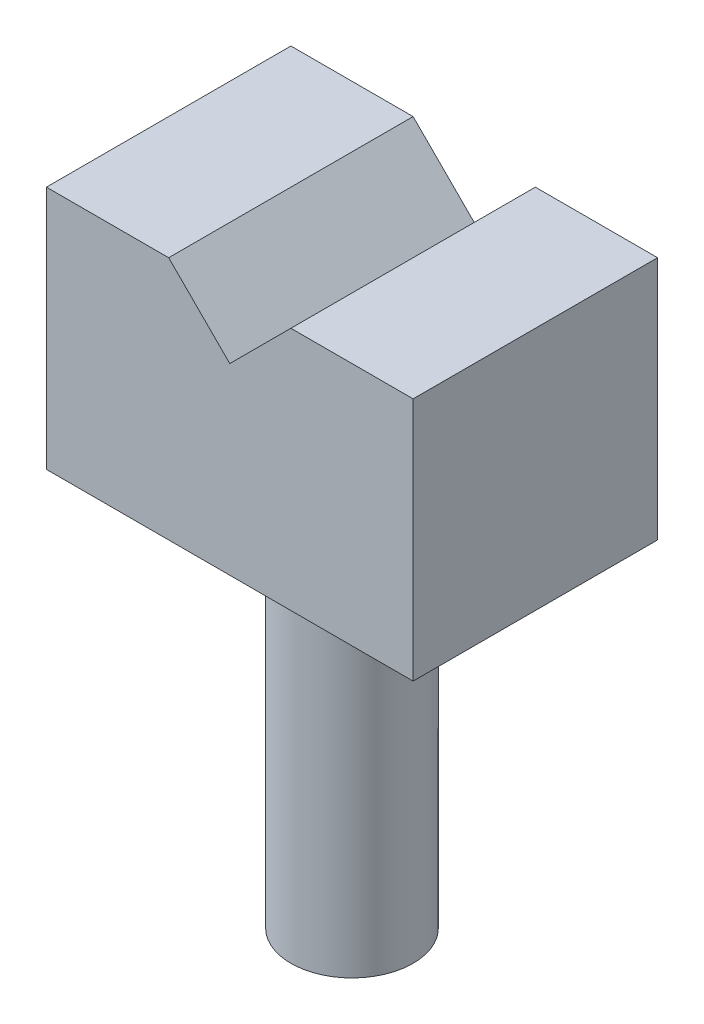
ISO-10303-21;
HEADER;
FILE_DESCRIPTION(('STEP AP214'),'2;1');
FILE_NAME('part.step','',(''),(''),'','','');
FILE_SCHEMA(('AUTOMOTIVE_DESIGN { 1 0 10303 214 1 1 1 1 }'));
ENDSEC;
DATA;
#1=APPLICATION_CONTEXT('core data for automotive mechanical design processes');
#2=APPLICATION_PROTOCOL_DEFINITION('international standard','automotive_design',2000,#1);
#3=PRODUCT_CONTEXT('',#1,'mechanical');
#4=PRODUCT('Part','Part','',(#3));
#5=PRODUCT_RELATED_PRODUCT_CATEGORY('part','',(#4));
#6=PRODUCT_DEFINITION_FORMATION('','',#4);
#7=PRODUCT_DEFINITION_CONTEXT('part definition',#1,'design');
#8=PRODUCT_DEFINITION('design','',#6,#7);
#9=PRODUCT_DEFINITION_SHAPE('','',#8);
#10=(LENGTH_UNIT() NAMED_UNIT(*) SI_UNIT(.MILLI.,.METRE.));
#11=(NAMED_UNIT(*) PLANE_ANGLE_UNIT() SI_UNIT($,.RADIAN.));
#12=(NAMED_UNIT(*) SI_UNIT($,.STERADIAN.) SOLID_ANGLE_UNIT());
#13=UNCERTAINTY_MEASURE_WITH_UNIT(LENGTH_MEASURE(1.E-05),#10,'distance_accuracy_value','');
#14=(GEOMETRIC_REPRESENTATION_CONTEXT(3) GLOBAL_UNCERTAINTY_ASSIGNED_CONTEXT((#13)) GLOBAL_UNIT_ASSIGNED_CONTEXT((#10,
#11,#12)) REPRESENTATION_CONTEXT('',''));
#15=CARTESIAN_POINT('',(0.,0.,0.));
#16=DIRECTION('',(0.,0.,1.));
#17=DIRECTION('',(1.,0.,0.));
#18=AXIS2_PLACEMENT_3D('',#15,#16,#17);
#19=CARTESIAN_POINT('',(0.,0.,20.));
#20=DIRECTION('',(0.,-1.,0.));
#21=DIRECTION('',(0.,0.,-1.));
#22=AXIS2_PLACEMENT_3D('',#19,#20,#21);
#23=PLANE('',#22);
#24=CARTESIAN_POINT('',(15.,0.,10.));
#25=DIRECTION('',(0.,-1.,0.));
#26=DIRECTION('',(0.,0.,-1.));
#27=AXIS2_PLACEMENT_3D('',#24,#25,#26);
#28=CIRCLE('',#27,5.);
#29=CARTESIAN_POINT('',(15.,0.,5.));
#30=VERTEX_POINT('',#29);
#31=EDGE_CURVE('E11',#30,#30,#28,.T.);
#32=ORIENTED_EDGE('',*,*,#31,.F.);
#33=EDGE_LOOP('',(#32));
#34=FACE_BOUND('',#33,.T.);
#35=DIRECTION('',(-1.,0.,0.));
#36=VECTOR('',#35,1.);
#37=CARTESIAN_POINT('',(0.,0.,0.));
#38=LINE('',#37,#36);
#39=CARTESIAN_POINT('',(30.,0.,0.));
#40=VERTEX_POINT('',#39);
#41=CARTESIAN_POINT('',(0.,0.,0.));
#42=VERTEX_POINT('',#41);
#43=EDGE_CURVE('E124',#40,#42,#38,.T.);
#44=ORIENTED_EDGE('',*,*,#43,.F.);
#45=DIRECTION('',(0.,0.,-1.));
#46=VECTOR('',#45,1.);
#47=CARTESIAN_POINT('',(30.,0.,20.));
#48=LINE('',#47,#46);
#49=CARTESIAN_POINT('',(30.,0.,20.));
#50=VERTEX_POINT('',#49);
#51=EDGE_CURVE('E38',#50,#40,#48,.T.);
#52=ORIENTED_EDGE('',*,*,#51,.F.);
#53=DIRECTION('',(-1.,0.,0.));
#54=VECTOR('',#53,1.);
#55=CARTESIAN_POINT('',(0.,0.,20.));
#56=LINE('',#55,#54);
#57=CARTESIAN_POINT('',(0.,0.,20.));
#58=VERTEX_POINT('',#57);
#59=EDGE_CURVE('E142',#50,#58,#56,.T.);
#60=ORIENTED_EDGE('',*,*,#59,.T.);
#61=DIRECTION('',(0.,0.,-1.));
#62=VECTOR('',#61,1.);
#63=CARTESIAN_POINT('',(0.,0.,20.));
#64=LINE('',#63,#62);
#65=EDGE_CURVE('E52',#58,#42,#64,.T.);
#66=ORIENTED_EDGE('',*,*,#65,.T.);
#67=EDGE_LOOP('',(#44,#52,#60,#66));
#68=FACE_BOUND('',#67,.T.);
#69=ADVANCED_FACE('F35',(#34,#68),#23,.T.);
#70=CARTESIAN_POINT('',(30.,0.,20.));
#71=DIRECTION('',(1.,0.,0.));
#72=DIRECTION('',(0.,0.,-1.));
#73=AXIS2_PLACEMENT_3D('',#70,#71,#72);
#74=PLANE('',#73);
#75=DIRECTION('',(0.,-1.,0.));
#76=VECTOR('',#75,1.);
#77=CARTESIAN_POINT('',(30.,0.,0.));
#78=LINE('',#77,#76);
#79=CARTESIAN_POINT('',(30.,20.,0.));
#80=VERTEX_POINT('',#79);
#81=EDGE_CURVE('E126',#80,#40,#78,.T.);
#82=ORIENTED_EDGE('',*,*,#81,.F.);
#83=DIRECTION('',(0.,0.,-1.));
#84=VECTOR('',#83,1.);
#85=CARTESIAN_POINT('',(30.,20.,20.));
#86=LINE('',#85,#84);
#87=CARTESIAN_POINT('',(30.,20.,20.));
#88=VERTEX_POINT('',#87);
#89=EDGE_CURVE('E147',#88,#80,#86,.T.);
#90=ORIENTED_EDGE('',*,*,#89,.F.);
#91=DIRECTION('',(0.,-1.,0.));
#92=VECTOR('',#91,1.);
#93=CARTESIAN_POINT('',(30.,0.,20.));
#94=LINE('',#93,#92);
#95=EDGE_CURVE('E156',#88,#50,#94,.T.);
#96=ORIENTED_EDGE('',*,*,#95,.T.);
#97=ORIENTED_EDGE('',*,*,#51,.T.);
#98=EDGE_LOOP('',(#82,#90,#96,#97));
#99=FACE_BOUND('',#98,.T.);
#100=ADVANCED_FACE('F154',(#99),#74,.T.);
#101=CARTESIAN_POINT('',(0.,20.,20.));
#102=DIRECTION('',(0.,1.,0.));
#103=DIRECTION('',(0.,0.,1.));
#104=AXIS2_PLACEMENT_3D('',#101,#102,#103);
#105=PLANE('',#104);
#106=DIRECTION('',(1.,0.,0.));
#107=VECTOR('',#106,1.);
#108=CARTESIAN_POINT('',(0.,20.,0.));
#109=LINE('',#108,#107);
#110=CARTESIAN_POINT('',(20.,20.,0.));
#111=VERTEX_POINT('',#110);
#112=EDGE_CURVE('E130',#111,#80,#109,.T.);
#113=ORIENTED_EDGE('',*,*,#112,.F.);
#114=DIRECTION('',(0.,0.,-1.));
#115=VECTOR('',#114,1.);
#116=CARTESIAN_POINT('',(20.,20.,20.));
#117=LINE('',#116,#115);
#118=CARTESIAN_POINT('',(20.,20.,20.));
#119=VERTEX_POINT('',#118);
#120=EDGE_CURVE('E146',#119,#111,#117,.T.);
#121=ORIENTED_EDGE('',*,*,#120,.F.);
#122=DIRECTION('',(1.,0.,0.));
#123=VECTOR('',#122,1.);
#124=CARTESIAN_POINT('',(0.,20.,20.));
#125=LINE('',#124,#123);
#126=EDGE_CURVE('E161',#119,#88,#125,.T.);
#127=ORIENTED_EDGE('',*,*,#126,.T.);
#128=ORIENTED_EDGE('',*,*,#89,.T.);
#129=EDGE_LOOP('',(#113,#121,#127,#128));
#130=FACE_BOUND('',#129,.T.);
#131=ADVANCED_FACE('F160',(#130),#105,.T.);
#132=CARTESIAN_POINT('',(0.,0.,20.));
#133=DIRECTION('',(0.707106781186548,-0.707106781186548,0.));
#134=DIRECTION('',(0.707106781186548,0.707106781186548,0.));
#135=AXIS2_PLACEMENT_3D('',#132,#133,#134);
#136=PLANE('',#135);
#137=DIRECTION('',(-0.707106781186548,-0.707106781186548,0.));
#138=VECTOR('',#137,1.);
#139=CARTESIAN_POINT('',(0.,0.,0.));
#140=LINE('',#139,#138);
#141=CARTESIAN_POINT('',(15.,15.,0.));
#142=VERTEX_POINT('',#141);
#143=EDGE_CURVE('E133',#111,#142,#140,.T.);
#144=ORIENTED_EDGE('',*,*,#143,.T.);
#145=DIRECTION('',(0.,0.,-1.));
#146=VECTOR('',#145,1.);
#147=CARTESIAN_POINT('',(15.,15.,20.));
#148=LINE('',#147,#146);
#149=CARTESIAN_POINT('',(15.,15.,20.));
#150=VERTEX_POINT('',#149);
#151=EDGE_CURVE('E106',#150,#142,#148,.T.);
#152=ORIENTED_EDGE('',*,*,#151,.F.);
#153=DIRECTION('',(-0.707106781186548,-0.707106781186548,0.));
#154=VECTOR('',#153,1.);
#155=CARTESIAN_POINT('',(0.,0.,20.));
#156=LINE('',#155,#154);
#157=EDGE_CURVE('E115',#119,#150,#156,.T.);
#158=ORIENTED_EDGE('',*,*,#157,.F.);
#159=ORIENTED_EDGE('',*,*,#120,.T.);
#160=EDGE_LOOP('',(#144,#152,#158,#159));
#161=FACE_BOUND('',#160,.T.);
#162=ADVANCED_FACE('F163',(#161),#136,.F.);
#163=CARTESIAN_POINT('',(15.,15.,20.));
#164=DIRECTION('',(0.707106781186548,0.707106781186547,0.));
#165=DIRECTION('',(-0.707106781186547,0.707106781186548,0.));
#166=AXIS2_PLACEMENT_3D('',#163,#164,#165);
#167=PLANE('',#166);
#168=DIRECTION('',(0.707106781186547,-0.707106781186548,0.));
#169=VECTOR('',#168,1.);
#170=CARTESIAN_POINT('',(15.,15.,0.));
#171=LINE('',#170,#169);
#172=CARTESIAN_POINT('',(10.,20.,0.));
#173=VERTEX_POINT('',#172);
#174=EDGE_CURVE('E102',#173,#142,#171,.T.);
#175=ORIENTED_EDGE('',*,*,#174,.F.);
#176=DIRECTION('',(0.,0.,-1.));
#177=VECTOR('',#176,1.);
#178=CARTESIAN_POINT('',(10.,20.,20.));
#179=LINE('',#178,#177);
#180=CARTESIAN_POINT('',(10.,20.,20.));
#181=VERTEX_POINT('',#180);
#182=EDGE_CURVE('E97',#181,#173,#179,.T.);
#183=ORIENTED_EDGE('',*,*,#182,.F.);
#184=DIRECTION('',(0.707106781186547,-0.707106781186548,0.));
#185=VECTOR('',#184,1.);
#186=CARTESIAN_POINT('',(15.,15.,20.));
#187=LINE('',#186,#185);
#188=EDGE_CURVE('E100',#181,#150,#187,.T.);
#189=ORIENTED_EDGE('',*,*,#188,.T.);
#190=ORIENTED_EDGE('',*,*,#151,.T.);
#191=EDGE_LOOP('',(#175,#183,#189,#190));
#192=FACE_BOUND('',#191,.T.);
#193=ADVANCED_FACE('F99',(#192),#167,.T.);
#194=CARTESIAN_POINT('',(0.,20.,20.));
#195=DIRECTION('',(0.,1.,0.));
#196=DIRECTION('',(0.,0.,1.));
#197=AXIS2_PLACEMENT_3D('',#194,#195,#196);
#198=PLANE('',#197);
#199=DIRECTION('',(1.,0.,0.));
#200=VECTOR('',#199,1.);
#201=CARTESIAN_POINT('',(0.,20.,0.));
#202=LINE('',#201,#200);
#203=CARTESIAN_POINT('',(0.,20.,0.));
#204=VERTEX_POINT('',#203);
#205=EDGE_CURVE('E137',#204,#173,#202,.T.);
#206=ORIENTED_EDGE('',*,*,#205,.F.);
#207=DIRECTION('',(0.,0.,-1.));
#208=VECTOR('',#207,1.);
#209=CARTESIAN_POINT('',(0.,20.,20.));
#210=LINE('',#209,#208);
#211=CARTESIAN_POINT('',(0.,20.,20.));
#212=VERTEX_POINT('',#211);
#213=EDGE_CURVE('E75',#212,#204,#210,.T.);
#214=ORIENTED_EDGE('',*,*,#213,.F.);
#215=DIRECTION('',(1.,0.,0.));
#216=VECTOR('',#215,1.);
#217=CARTESIAN_POINT('',(0.,20.,20.));
#218=LINE('',#217,#216);
#219=EDGE_CURVE('E112',#212,#181,#218,.T.);
#220=ORIENTED_EDGE('',*,*,#219,.T.);
#221=ORIENTED_EDGE('',*,*,#182,.T.);
#222=EDGE_LOOP('',(#206,#214,#220,#221));
#223=FACE_BOUND('',#222,.T.);
#224=ADVANCED_FACE('F118',(#223),#198,.T.);
#225=CARTESIAN_POINT('',(0.,0.,20.));
#226=DIRECTION('',(-1.,0.,0.));
#227=DIRECTION('',(0.,0.,1.));
#228=AXIS2_PLACEMENT_3D('',#225,#226,#227);
#229=PLANE('',#228);
#230=DIRECTION('',(0.,1.,0.));
#231=VECTOR('',#230,1.);
#232=CARTESIAN_POINT('',(0.,0.,0.));
#233=LINE('',#232,#231);
#234=EDGE_CURVE('E139',#42,#204,#233,.T.);
#235=ORIENTED_EDGE('',*,*,#234,.F.);
#236=ORIENTED_EDGE('',*,*,#65,.F.);
#237=DIRECTION('',(0.,1.,0.));
#238=VECTOR('',#237,1.);
#239=CARTESIAN_POINT('',(0.,0.,20.));
#240=LINE('',#239,#238);
#241=EDGE_CURVE('E119',#58,#212,#240,.T.);
#242=ORIENTED_EDGE('',*,*,#241,.T.);
#243=ORIENTED_EDGE('',*,*,#213,.T.);
#244=EDGE_LOOP('',(#235,#236,#242,#243));
#245=FACE_BOUND('',#244,.T.);
#246=ADVANCED_FACE('F194',(#245),#229,.T.);
#247=CARTESIAN_POINT('',(0.,0.,20.));
#248=DIRECTION('',(0.,0.,1.));
#249=DIRECTION('',(1.,0.,0.));
#250=AXIS2_PLACEMENT_3D('',#247,#248,#249);
#251=PLANE('',#250);
#252=ORIENTED_EDGE('',*,*,#59,.F.);
#253=ORIENTED_EDGE('',*,*,#95,.F.);
#254=ORIENTED_EDGE('',*,*,#126,.F.);
#255=ORIENTED_EDGE('',*,*,#157,.T.);
#256=ORIENTED_EDGE('',*,*,#188,.F.);
#257=ORIENTED_EDGE('',*,*,#219,.F.);
#258=ORIENTED_EDGE('',*,*,#241,.F.);
#259=EDGE_LOOP('',(#252,#253,#254,#255,#256,#257,#258));
#260=FACE_BOUND('',#259,.T.);
#261=ADVANCED_FACE('F110',(#260),#251,.T.);
#262=CARTESIAN_POINT('',(0.,0.,0.));
#263=DIRECTION('',(0.,0.,1.));
#264=DIRECTION('',(1.,0.,0.));
#265=AXIS2_PLACEMENT_3D('',#262,#263,#264);
#266=PLANE('',#265);
#267=ORIENTED_EDGE('',*,*,#43,.T.);
#268=ORIENTED_EDGE('',*,*,#234,.T.);
#269=ORIENTED_EDGE('',*,*,#205,.T.);
#270=ORIENTED_EDGE('',*,*,#174,.T.);
#271=ORIENTED_EDGE('',*,*,#143,.F.);
#272=ORIENTED_EDGE('',*,*,#112,.T.);
#273=ORIENTED_EDGE('',*,*,#81,.T.);
#274=EDGE_LOOP('',(#267,#268,#269,#270,#271,#272,#273));
#275=FACE_BOUND('',#274,.T.);
#276=ADVANCED_FACE('F158',(#275),#266,.F.);
#277=CARTESIAN_POINT('',(15.,-30.,10.));
#278=DIRECTION('',(0.,1.,0.));
#279=DIRECTION('',(0.,0.,1.));
#280=AXIS2_PLACEMENT_3D('',#277,#278,#279);
#281=CYLINDRICAL_SURFACE('',#280,5.);
#282=CARTESIAN_POINT('',(15.,-30.,10.));
#283=DIRECTION('',(0.,-1.,0.));
#284=DIRECTION('',(0.,0.,-1.));
#285=AXIS2_PLACEMENT_3D('',#282,#283,#284);
#286=CIRCLE('',#285,5.);
#287=CARTESIAN_POINT('',(15.,-30.,5.));
#288=VERTEX_POINT('',#287);
#289=EDGE_CURVE('E127',#288,#288,#286,.T.);
#290=ORIENTED_EDGE('',*,*,#289,.F.);
#291=EDGE_LOOP('',(#290));
#292=FACE_BOUND('',#291,.T.);
#293=ORIENTED_EDGE('',*,*,#31,.T.);
#294=EDGE_LOOP('',(#293));
#295=FACE_BOUND('',#294,.T.);
#296=ADVANCED_FACE('F173',(#292,#295),#281,.T.);
#297=CARTESIAN_POINT('',(15.,-30.,10.));
#298=DIRECTION('',(0.,-1.,0.));
#299=DIRECTION('',(0.,0.,-1.));
#300=AXIS2_PLACEMENT_3D('',#297,#298,#299);
#301=PLANE('',#300);
#302=ORIENTED_EDGE('',*,*,#289,.T.);
#303=EDGE_LOOP('',(#302));
#304=FACE_BOUND('',#303,.T.);
#305=ADVANCED_FACE('F171',(#304),#301,.T.);
#306=CLOSED_SHELL('',(#69,#100,#131,#162,#193,#224,#246,#261,#276,#296,#305));
#307=MANIFOLD_SOLID_BREP('B2',#306);
#308=ADVANCED_BREP_SHAPE_REPRESENTATION('',(#18,#307),#14);
#309=SHAPE_DEFINITION_REPRESENTATION(#9,#308);
ENDSEC;
END-ISO-10303-21;
